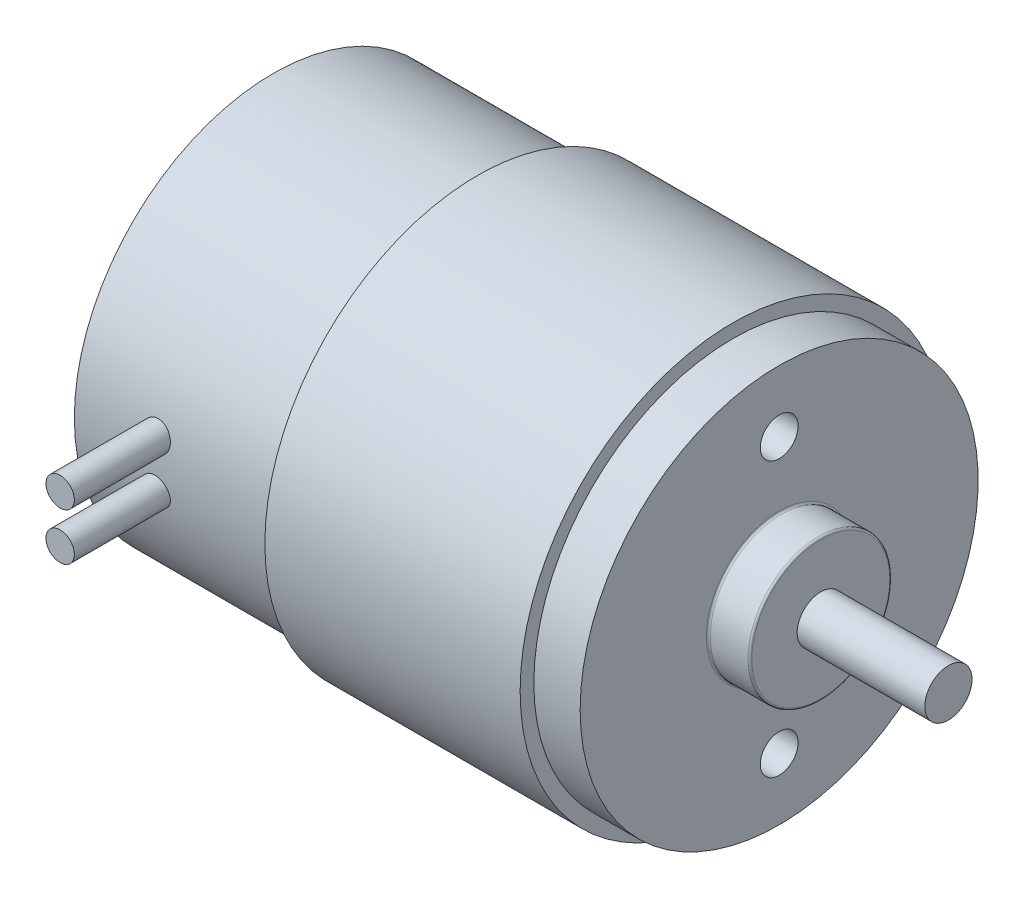
ISO-10303-21;
HEADER;
FILE_DESCRIPTION(('STEP AP214'),'2;1');
FILE_NAME('part.step','',(''),(''),'','','');
FILE_SCHEMA(('AUTOMOTIVE_DESIGN { 1 0 10303 214 1 1 1 1 }'));
ENDSEC;
DATA;
#1=APPLICATION_CONTEXT('core data for automotive mechanical design processes');
#2=APPLICATION_PROTOCOL_DEFINITION('international standard','automotive_design',2000,#1);
#3=PRODUCT_CONTEXT('',#1,'mechanical');
#4=PRODUCT('Part','Part','',(#3));
#5=PRODUCT_RELATED_PRODUCT_CATEGORY('part','',(#4));
#6=PRODUCT_DEFINITION_FORMATION('','',#4);
#7=PRODUCT_DEFINITION_CONTEXT('part definition',#1,'design');
#8=PRODUCT_DEFINITION('design','',#6,#7);
#9=PRODUCT_DEFINITION_SHAPE('','',#8);
#10=(LENGTH_UNIT() NAMED_UNIT(*) SI_UNIT(.MILLI.,.METRE.));
#11=(NAMED_UNIT(*) PLANE_ANGLE_UNIT() SI_UNIT($,.RADIAN.));
#12=(NAMED_UNIT(*) SI_UNIT($,.STERADIAN.) SOLID_ANGLE_UNIT());
#13=UNCERTAINTY_MEASURE_WITH_UNIT(LENGTH_MEASURE(1.E-05),#10,'distance_accuracy_value','');
#14=(GEOMETRIC_REPRESENTATION_CONTEXT(3) GLOBAL_UNCERTAINTY_ASSIGNED_CONTEXT((#13)) GLOBAL_UNIT_ASSIGNED_CONTEXT((#10,
#11,#12)) REPRESENTATION_CONTEXT('',''));
#15=CARTESIAN_POINT('',(0.,0.,0.));
#16=DIRECTION('',(0.,0.,1.));
#17=DIRECTION('',(1.,0.,0.));
#18=AXIS2_PLACEMENT_3D('',#15,#16,#17);
#19=CARTESIAN_POINT('',(-62.2,-7.5,0.));
#20=DIRECTION('',(-1.,0.,0.));
#21=DIRECTION('',(0.,0.,1.));
#22=AXIS2_PLACEMENT_3D('',#19,#20,#21);
#23=PLANE('',#22);
#24=CARTESIAN_POINT('',(-62.2,0.,0.));
#25=DIRECTION('',(-1.,0.,0.));
#26=DIRECTION('',(0.,0.,1.));
#27=AXIS2_PLACEMENT_3D('',#24,#25,#26);
#28=CIRCLE('',#27,7.3);
#29=CARTESIAN_POINT('',(-62.2,0.,7.3));
#30=VERTEX_POINT('',#29);
#31=EDGE_CURVE('P0_E22',#30,#30,#28,.T.);
#32=ORIENTED_EDGE('',*,*,#31,.T.);
#33=EDGE_LOOP('',(#32));
#34=FACE_BOUND('',#33,.T.);
#35=CARTESIAN_POINT('',(-62.2,0.,0.));
#36=DIRECTION('',(-1.,0.,0.));
#37=DIRECTION('',(0.,0.,1.));
#38=AXIS2_PLACEMENT_3D('',#35,#36,#37);
#39=CIRCLE('',#38,2.5);
#40=CARTESIAN_POINT('',(-62.2,0.,2.5));
#41=VERTEX_POINT('',#40);
#42=EDGE_CURVE('P0_E57',#41,#41,#39,.F.);
#43=ORIENTED_EDGE('',*,*,#42,.T.);
#44=EDGE_LOOP('',(#43));
#45=FACE_BOUND('',#44,.T.);
#46=ADVANCED_FACE('P0_F15',(#34,#45),#23,.T.);
#47=CARTESIAN_POINT('',(-57.,0.,0.));
#48=DIRECTION('',(-1.,0.,0.));
#49=DIRECTION('',(0.,0.,1.));
#50=AXIS2_PLACEMENT_3D('',#47,#48,#49);
#51=CYLINDRICAL_SURFACE('',#50,7.5);
#52=CARTESIAN_POINT('',(-57.4,0.,0.));
#53=DIRECTION('',(-1.,0.,0.));
#54=DIRECTION('',(0.,0.,1.));
#55=AXIS2_PLACEMENT_3D('',#52,#53,#54);
#56=CIRCLE('',#55,7.5);
#57=CARTESIAN_POINT('',(-57.4,0.,7.5));
#58=VERTEX_POINT('',#57);
#59=EDGE_CURVE('P0_E41',#58,#58,#56,.T.);
#60=ORIENTED_EDGE('',*,*,#59,.T.);
#61=EDGE_LOOP('',(#60));
#62=FACE_BOUND('',#61,.T.);
#63=CARTESIAN_POINT('',(-62.,0.,0.));
#64=DIRECTION('',(-1.,0.,0.));
#65=DIRECTION('',(0.,0.,1.));
#66=AXIS2_PLACEMENT_3D('',#63,#64,#65);
#67=CIRCLE('',#66,7.5);
#68=CARTESIAN_POINT('',(-62.,0.,7.5));
#69=VERTEX_POINT('',#68);
#70=EDGE_CURVE('P0_E44',#69,#69,#67,.F.);
#71=ORIENTED_EDGE('',*,*,#70,.T.);
#72=EDGE_LOOP('',(#71));
#73=FACE_BOUND('',#72,.T.);
#74=ADVANCED_FACE('P0_F135',(#62,#73),#51,.T.);
#75=CARTESIAN_POINT('',(-57.2,-7.5,0.));
#76=DIRECTION('',(-1.,0.,0.));
#77=DIRECTION('',(0.,0.,1.));
#78=AXIS2_PLACEMENT_3D('',#75,#76,#77);
#79=PLANE('',#78);
#80=CARTESIAN_POINT('',(-57.2,0.,0.));
#81=DIRECTION('',(-1.,0.,0.));
#82=DIRECTION('',(0.,0.,1.));
#83=AXIS2_PLACEMENT_3D('',#80,#81,#82);
#84=CIRCLE('',#83,7.7);
#85=CARTESIAN_POINT('',(-57.2,0.,7.7));
#86=VERTEX_POINT('',#85);
#87=EDGE_CURVE('P0_E38',#86,#86,#84,.F.);
#88=ORIENTED_EDGE('',*,*,#87,.T.);
#89=EDGE_LOOP('',(#88));
#90=FACE_BOUND('',#89,.T.);
#91=CARTESIAN_POINT('',(-57.2,0.,0.));
#92=DIRECTION('',(-1.,0.,0.));
#93=DIRECTION('',(0.,0.,1.));
#94=AXIS2_PLACEMENT_3D('',#91,#92,#93);
#95=CIRCLE('',#94,20.35);
#96=CARTESIAN_POINT('',(-57.2,0.,20.35));
#97=VERTEX_POINT('',#96);
#98=EDGE_CURVE('P0_E53',#97,#97,#95,.T.);
#99=ORIENTED_EDGE('',*,*,#98,.T.);
#100=EDGE_LOOP('',(#99));
#101=FACE_BOUND('',#100,.T.);
#102=ADVANCED_FACE('P0_F141',(#90,#101),#79,.T.);
#103=CARTESIAN_POINT('',(-57.,0.,0.));
#104=DIRECTION('',(-1.,0.,0.));
#105=DIRECTION('',(0.,0.,1.));
#106=AXIS2_PLACEMENT_3D('',#103,#104,#105);
#107=CYLINDRICAL_SURFACE('',#106,20.35);
#108=CARTESIAN_POINT('',(-57.9,0.,0.));
#109=DIRECTION('',(-1.,0.,0.));
#110=DIRECTION('',(0.,0.,1.));
#111=AXIS2_PLACEMENT_3D('',#108,#109,#110);
#112=CIRCLE('',#111,20.35);
#113=CARTESIAN_POINT('',(-57.9,0.,20.35));
#114=VERTEX_POINT('',#113);
#115=EDGE_CURVE('P0_E61',#114,#114,#112,.T.);
#116=ORIENTED_EDGE('',*,*,#115,.T.);
#117=EDGE_LOOP('',(#116));
#118=FACE_BOUND('',#117,.T.);
#119=ORIENTED_EDGE('',*,*,#98,.F.);
#120=EDGE_LOOP('',(#119));
#121=FACE_BOUND('',#120,.T.);
#122=ADVANCED_FACE('P0_F295',(#118,#121),#107,.F.);
#123=CARTESIAN_POINT('',(-57.9,-21.05,0.));
#124=DIRECTION('',(-1.,0.,0.));
#125=DIRECTION('',(0.,0.,1.));
#126=AXIS2_PLACEMENT_3D('',#123,#124,#125);
#127=PLANE('',#126);
#128=CARTESIAN_POINT('',(-57.9,0.,0.));
#129=DIRECTION('',(-1.,0.,0.));
#130=DIRECTION('',(0.,0.,1.));
#131=AXIS2_PLACEMENT_3D('',#128,#129,#130);
#132=CIRCLE('',#131,21.05);
#133=CARTESIAN_POINT('',(-57.9,0.,21.05));
#134=VERTEX_POINT('',#133);
#135=EDGE_CURVE('P0_E64',#134,#134,#132,.T.);
#136=ORIENTED_EDGE('',*,*,#135,.T.);
#137=EDGE_LOOP('',(#136));
#138=FACE_BOUND('',#137,.T.);
#139=ORIENTED_EDGE('',*,*,#115,.F.);
#140=EDGE_LOOP('',(#139));
#141=FACE_BOUND('',#140,.T.);
#142=ADVANCED_FACE('P0_F132',(#138,#141),#127,.T.);
#143=CARTESIAN_POINT('',(-57.,0.,0.));
#144=DIRECTION('',(-1.,0.,0.));
#145=DIRECTION('',(0.,0.,1.));
#146=AXIS2_PLACEMENT_3D('',#143,#144,#145);
#147=CYLINDRICAL_SURFACE('',#146,21.05);
#148=CARTESIAN_POINT('',(-36.3,0.,0.));
#149=DIRECTION('',(-1.,0.,0.));
#150=DIRECTION('',(0.,0.,1.));
#151=AXIS2_PLACEMENT_3D('',#148,#149,#150);
#152=CIRCLE('',#151,21.05);
#153=CARTESIAN_POINT('',(-36.3,0.,21.05));
#154=VERTEX_POINT('',#153);
#155=EDGE_CURVE('P0_E50',#154,#154,#152,.F.);
#156=ORIENTED_EDGE('',*,*,#155,.F.);
#157=EDGE_LOOP('',(#156));
#158=FACE_BOUND('',#157,.T.);
#159=ORIENTED_EDGE('',*,*,#135,.F.);
#160=EDGE_LOOP('',(#159));
#161=FACE_BOUND('',#160,.T.);
#162=ADVANCED_FACE('P0_F120',(#158,#161),#147,.T.);
#163=CARTESIAN_POINT('',(0.,0.,0.));
#164=DIRECTION('',(-1.,0.,0.));
#165=DIRECTION('',(0.,0.,1.));
#166=AXIS2_PLACEMENT_3D('',#163,#164,#165);
#167=CYLINDRICAL_SURFACE('',#166,2.5);
#168=ORIENTED_EDGE('',*,*,#42,.F.);
#169=EDGE_LOOP('',(#168));
#170=FACE_BOUND('',#169,.T.);
#171=CARTESIAN_POINT('',(-62.5,0.,0.));
#172=DIRECTION('',(-1.,0.,0.));
#173=DIRECTION('',(0.,0.,1.));
#174=AXIS2_PLACEMENT_3D('',#171,#172,#173);
#175=CIRCLE('',#174,2.5);
#176=CARTESIAN_POINT('',(-62.5,0.,2.5));
#177=VERTEX_POINT('',#176);
#178=EDGE_CURVE('P0_E74',#177,#177,#175,.T.);
#179=ORIENTED_EDGE('',*,*,#178,.F.);
#180=EDGE_LOOP('',(#179));
#181=FACE_BOUND('',#180,.T.);
#182=ADVANCED_FACE('P0_F131',(#170,#181),#167,.T.);
#183=CARTESIAN_POINT('',(-62.5,2.5,0.));
#184=DIRECTION('',(1.,0.,0.));
#185=DIRECTION('',(0.,0.,-1.));
#186=AXIS2_PLACEMENT_3D('',#183,#184,#185);
#187=PLANE('',#186);
#188=ORIENTED_EDGE('',*,*,#178,.T.);
#189=EDGE_LOOP('',(#188));
#190=FACE_BOUND('',#189,.T.);
#191=ADVANCED_FACE('P0_F190',(#190),#187,.F.);
#192=CARTESIAN_POINT('',(-9.3,0.,0.));
#193=DIRECTION('',(1.,0.,0.));
#194=DIRECTION('',(0.,0.,-1.));
#195=AXIS2_PLACEMENT_3D('',#192,#193,#194);
#196=PLANE('',#195);
#197=CARTESIAN_POINT('',(-9.3,0.,0.));
#198=DIRECTION('',(1.,0.,0.));
#199=DIRECTION('',(0.,0.,-1.));
#200=AXIS2_PLACEMENT_3D('',#197,#198,#199);
#201=CIRCLE('',#200,21.05);
#202=CARTESIAN_POINT('',(-9.3,0.,-21.05));
#203=VERTEX_POINT('',#202);
#204=EDGE_CURVE('P0_E47',#203,#203,#201,.F.);
#205=ORIENTED_EDGE('',*,*,#204,.T.);
#206=EDGE_LOOP('',(#205));
#207=FACE_BOUND('',#206,.T.);
#208=CARTESIAN_POINT('',(-9.3,0.,0.));
#209=DIRECTION('',(-1.,0.,0.));
#210=DIRECTION('',(0.,0.,1.));
#211=AXIS2_PLACEMENT_3D('',#208,#209,#210);
#212=CIRCLE('',#211,22.5);
#213=CARTESIAN_POINT('',(-9.3,0.,22.5));
#214=VERTEX_POINT('',#213);
#215=EDGE_CURVE('P0_E77',#214,#214,#212,.T.);
#216=ORIENTED_EDGE('',*,*,#215,.F.);
#217=EDGE_LOOP('',(#216));
#218=FACE_BOUND('',#217,.T.);
#219=ADVANCED_FACE('P0_F193',(#207,#218),#196,.T.);
#220=CARTESIAN_POINT('',(0.,0.,0.));
#221=DIRECTION('',(-1.,0.,0.));
#222=DIRECTION('',(0.,0.,1.));
#223=AXIS2_PLACEMENT_3D('',#220,#221,#222);
#224=CYLINDRICAL_SURFACE('',#223,22.5);
#225=ORIENTED_EDGE('',*,*,#215,.T.);
#226=EDGE_LOOP('',(#225));
#227=FACE_BOUND('',#226,.T.);
#228=CARTESIAN_POINT('',(-36.3,0.,0.));
#229=DIRECTION('',(-1.,0.,0.));
#230=DIRECTION('',(0.,0.,1.));
#231=AXIS2_PLACEMENT_3D('',#228,#229,#230);
#232=CIRCLE('',#231,22.5);
#233=CARTESIAN_POINT('',(-36.3,0.,22.5));
#234=VERTEX_POINT('',#233);
#235=EDGE_CURVE('P0_E80',#234,#234,#232,.T.);
#236=ORIENTED_EDGE('',*,*,#235,.F.);
#237=EDGE_LOOP('',(#236));
#238=FACE_BOUND('',#237,.T.);
#239=ADVANCED_FACE('P0_F197',(#227,#238),#224,.T.);
#240=CARTESIAN_POINT('',(-36.3,0.,0.));
#241=DIRECTION('',(-1.,0.,0.));
#242=DIRECTION('',(0.,0.,1.));
#243=AXIS2_PLACEMENT_3D('',#240,#241,#242);
#244=PLANE('',#243);
#245=ORIENTED_EDGE('',*,*,#235,.T.);
#246=EDGE_LOOP('',(#245));
#247=FACE_BOUND('',#246,.T.);
#248=ORIENTED_EDGE('',*,*,#155,.T.);
#249=EDGE_LOOP('',(#248));
#250=FACE_BOUND('',#249,.T.);
#251=ADVANCED_FACE('P0_F185',(#247,#250),#244,.T.);
#252=CARTESIAN_POINT('',(13.5,0.,0.));
#253=DIRECTION('',(-1.,0.,0.));
#254=DIRECTION('',(0.,0.,1.));
#255=AXIS2_PLACEMENT_3D('',#252,#253,#254);
#256=PLANE('',#255);
#257=CARTESIAN_POINT('',(13.5,0.,0.));
#258=DIRECTION('',(-1.,0.,0.));
#259=DIRECTION('',(0.,0.,1.));
#260=AXIS2_PLACEMENT_3D('',#257,#258,#259);
#261=CIRCLE('',#260,2.5);
#262=CARTESIAN_POINT('',(13.5,0.,2.5));
#263=VERTEX_POINT('',#262);
#264=EDGE_CURVE('P0_E58',#263,#263,#261,.T.);
#265=ORIENTED_EDGE('',*,*,#264,.F.);
#266=EDGE_LOOP('',(#265));
#267=FACE_BOUND('',#266,.T.);
#268=ADVANCED_FACE('P0_F182',(#267),#256,.F.);
#269=CARTESIAN_POINT('',(0.,0.,0.));
#270=DIRECTION('',(1.,0.,0.));
#271=DIRECTION('',(0.,0.,-1.));
#272=AXIS2_PLACEMENT_3D('',#269,#270,#271);
#273=CIRCLE('',#272,2.5);
#274=CARTESIAN_POINT('',(0.,0.,-2.5));
#275=VERTEX_POINT('',#274);
#276=EDGE_CURVE('P0_E54',#275,#275,#273,.F.);
#277=ORIENTED_EDGE('',*,*,#276,.F.);
#278=EDGE_LOOP('',(#277));
#279=FACE_BOUND('',#278,.T.);
#280=ORIENTED_EDGE('',*,*,#264,.T.);
#281=EDGE_LOOP('',(#280));
#282=FACE_BOUND('',#281,.T.);
#283=ADVANCED_FACE('P0_F179',(#279,#282),#167,.T.);
#284=CARTESIAN_POINT('',(0.,0.,0.));
#285=DIRECTION('',(1.,0.,0.));
#286=DIRECTION('',(0.,0.,-1.));
#287=AXIS2_PLACEMENT_3D('',#284,#285,#286);
#288=PLANE('',#287);
#289=CARTESIAN_POINT('',(0.,0.,0.));
#290=DIRECTION('',(1.,0.,0.));
#291=DIRECTION('',(0.,0.,-1.));
#292=AXIS2_PLACEMENT_3D('',#289,#290,#291);
#293=CIRCLE('',#292,7.3);
#294=CARTESIAN_POINT('',(0.,0.,-7.3));
#295=VERTEX_POINT('',#294);
#296=EDGE_CURVE('P0_E10',#295,#295,#293,.T.);
#297=ORIENTED_EDGE('',*,*,#296,.T.);
#298=EDGE_LOOP('',(#297));
#299=FACE_BOUND('',#298,.T.);
#300=ORIENTED_EDGE('',*,*,#276,.T.);
#301=EDGE_LOOP('',(#300));
#302=FACE_BOUND('',#301,.T.);
#303=ADVANCED_FACE('P0_F172',(#299,#302),#288,.T.);
#304=CARTESIAN_POINT('',(-57.,0.,0.));
#305=DIRECTION('',(-1.,0.,0.));
#306=DIRECTION('',(0.,0.,1.));
#307=AXIS2_PLACEMENT_3D('',#304,#305,#306);
#308=CYLINDRICAL_SURFACE('',#307,7.5);
#309=CARTESIAN_POINT('',(-4.2,0.,0.));
#310=DIRECTION('',(1.,0.,0.));
#311=DIRECTION('',(0.,0.,-1.));
#312=AXIS2_PLACEMENT_3D('',#309,#310,#311);
#313=CIRCLE('',#312,7.5);
#314=CARTESIAN_POINT('',(-4.2,0.,-7.5));
#315=VERTEX_POINT('',#314);
#316=EDGE_CURVE('P0_E26',#315,#315,#313,.T.);
#317=ORIENTED_EDGE('',*,*,#316,.T.);
#318=EDGE_LOOP('',(#317));
#319=FACE_BOUND('',#318,.T.);
#320=CARTESIAN_POINT('',(-0.2,0.,0.));
#321=DIRECTION('',(1.,0.,0.));
#322=DIRECTION('',(0.,0.,-1.));
#323=AXIS2_PLACEMENT_3D('',#320,#321,#322);
#324=CIRCLE('',#323,7.5);
#325=CARTESIAN_POINT('',(-0.2,0.,-7.5));
#326=VERTEX_POINT('',#325);
#327=EDGE_CURVE('P0_E30',#326,#326,#324,.F.);
#328=ORIENTED_EDGE('',*,*,#327,.T.);
#329=EDGE_LOOP('',(#328));
#330=FACE_BOUND('',#329,.T.);
#331=ADVANCED_FACE('P0_F109',(#319,#330),#308,.T.);
#332=CARTESIAN_POINT('',(-4.4,-7.5,0.));
#333=DIRECTION('',(1.,0.,0.));
#334=DIRECTION('',(0.,0.,-1.));
#335=AXIS2_PLACEMENT_3D('',#332,#333,#334);
#336=PLANE('',#335);
#337=CARTESIAN_POINT('',(-4.4,0.,0.));
#338=DIRECTION('',(1.,0.,0.));
#339=DIRECTION('',(0.,0.,-1.));
#340=AXIS2_PLACEMENT_3D('',#337,#338,#339);
#341=CIRCLE('',#340,7.7);
#342=CARTESIAN_POINT('',(-4.4,0.,-7.7));
#343=VERTEX_POINT('',#342);
#344=EDGE_CURVE('P0_E35',#343,#343,#341,.F.);
#345=ORIENTED_EDGE('',*,*,#344,.T.);
#346=EDGE_LOOP('',(#345));
#347=FACE_BOUND('',#346,.T.);
#348=CARTESIAN_POINT('',(-4.4,-14.5,0.));
#349=DIRECTION('',(1.,0.,0.));
#350=DIRECTION('',(0.,0.,-1.));
#351=AXIS2_PLACEMENT_3D('',#348,#349,#350);
#352=CIRCLE('',#351,2.);
#353=CARTESIAN_POINT('',(-4.4,-14.5,-2.));
#354=VERTEX_POINT('',#353);
#355=EDGE_CURVE('P0_E90',#354,#354,#352,.T.);
#356=ORIENTED_EDGE('',*,*,#355,.F.);
#357=EDGE_LOOP('',(#356));
#358=FACE_BOUND('',#357,.T.);
#359=CARTESIAN_POINT('',(-4.4,14.5,0.));
#360=DIRECTION('',(1.,0.,0.));
#361=DIRECTION('',(0.,0.,-1.));
#362=AXIS2_PLACEMENT_3D('',#359,#360,#361);
#363=CIRCLE('',#362,2.);
#364=CARTESIAN_POINT('',(-4.4,14.5,-1.99999999999999));
#365=VERTEX_POINT('',#364);
#366=EDGE_CURVE('P0_E84',#365,#365,#363,.T.);
#367=ORIENTED_EDGE('',*,*,#366,.F.);
#368=EDGE_LOOP('',(#367));
#369=FACE_BOUND('',#368,.T.);
#370=CARTESIAN_POINT('',(-4.4,0.,0.));
#371=DIRECTION('',(-1.,0.,0.));
#372=DIRECTION('',(0.,0.,1.));
#373=AXIS2_PLACEMENT_3D('',#370,#371,#372);
#374=CIRCLE('',#373,21.05);
#375=CARTESIAN_POINT('',(-4.4,0.,21.05));
#376=VERTEX_POINT('',#375);
#377=EDGE_CURVE('P0_E67',#376,#376,#374,.T.);
#378=ORIENTED_EDGE('',*,*,#377,.F.);
#379=EDGE_LOOP('',(#378));
#380=FACE_BOUND('',#379,.T.);
#381=ADVANCED_FACE('P0_F105',(#347,#358,#369,#380),#336,.T.);
#382=ORIENTED_EDGE('',*,*,#204,.F.);
#383=EDGE_LOOP('',(#382));
#384=FACE_BOUND('',#383,.T.);
#385=ORIENTED_EDGE('',*,*,#377,.T.);
#386=EDGE_LOOP('',(#385));
#387=FACE_BOUND('',#386,.T.);
#388=ADVANCED_FACE('P0_F108',(#384,#387),#147,.T.);
#389=CARTESIAN_POINT('',(-9.4,14.5,0.));
#390=DIRECTION('',(1.,0.,0.));
#391=DIRECTION('',(0.,0.,-1.));
#392=AXIS2_PLACEMENT_3D('',#389,#390,#391);
#393=CYLINDRICAL_SURFACE('',#392,2.);
#394=CARTESIAN_POINT('',(-9.4,14.5,0.));
#395=DIRECTION('',(1.,0.,0.));
#396=DIRECTION('',(0.,0.,-1.));
#397=AXIS2_PLACEMENT_3D('',#394,#395,#396);
#398=CIRCLE('',#397,2.);
#399=CARTESIAN_POINT('',(-9.4,14.5,-1.99999999999999));
#400=VERTEX_POINT('',#399);
#401=EDGE_CURVE('P0_E83',#400,#400,#398,.T.);
#402=ORIENTED_EDGE('',*,*,#401,.F.);
#403=EDGE_LOOP('',(#402));
#404=FACE_BOUND('',#403,.T.);
#405=ORIENTED_EDGE('',*,*,#366,.T.);
#406=EDGE_LOOP('',(#405));
#407=FACE_BOUND('',#406,.T.);
#408=ADVANCED_FACE('P0_F117',(#404,#407),#393,.F.);
#409=CARTESIAN_POINT('',(-9.4,14.5,0.));
#410=DIRECTION('',(1.,0.,0.));
#411=DIRECTION('',(0.,0.,-1.));
#412=AXIS2_PLACEMENT_3D('',#409,#410,#411);
#413=PLANE('',#412);
#414=ORIENTED_EDGE('',*,*,#401,.T.);
#415=EDGE_LOOP('',(#414));
#416=FACE_BOUND('',#415,.T.);
#417=ADVANCED_FACE('P0_F101',(#416),#413,.T.);
#418=CARTESIAN_POINT('',(-9.4,-14.5,0.));
#419=DIRECTION('',(1.,0.,0.));
#420=DIRECTION('',(0.,0.,-1.));
#421=AXIS2_PLACEMENT_3D('',#418,#419,#420);
#422=CYLINDRICAL_SURFACE('',#421,2.);
#423=CARTESIAN_POINT('',(-9.4,-14.5,0.));
#424=DIRECTION('',(1.,0.,0.));
#425=DIRECTION('',(0.,0.,-1.));
#426=AXIS2_PLACEMENT_3D('',#423,#424,#425);
#427=CIRCLE('',#426,2.);
#428=CARTESIAN_POINT('',(-9.4,-14.5,-2.));
#429=VERTEX_POINT('',#428);
#430=EDGE_CURVE('P0_E87',#429,#429,#427,.T.);
#431=ORIENTED_EDGE('',*,*,#430,.F.);
#432=EDGE_LOOP('',(#431));
#433=FACE_BOUND('',#432,.T.);
#434=ORIENTED_EDGE('',*,*,#355,.T.);
#435=EDGE_LOOP('',(#434));
#436=FACE_BOUND('',#435,.T.);
#437=ADVANCED_FACE('P0_F98',(#433,#436),#422,.F.);
#438=CARTESIAN_POINT('',(-9.4,-14.5,0.));
#439=DIRECTION('',(1.,0.,0.));
#440=DIRECTION('',(0.,0.,-1.));
#441=AXIS2_PLACEMENT_3D('',#438,#439,#440);
#442=PLANE('',#441);
#443=ORIENTED_EDGE('',*,*,#430,.T.);
#444=EDGE_LOOP('',(#443));
#445=FACE_BOUND('',#444,.T.);
#446=ADVANCED_FACE('P0_F96',(#445),#442,.T.);
#447=CARTESIAN_POINT('',(-57.4,0.,0.));
#448=DIRECTION('',(-1.,0.,0.));
#449=DIRECTION('',(0.,0.,1.));
#450=AXIS2_PLACEMENT_3D('',#447,#448,#449);
#451=TOROIDAL_SURFACE('',#450,7.7,0.2);
#452=ORIENTED_EDGE('',*,*,#87,.F.);
#453=EDGE_LOOP('',(#452));
#454=FACE_BOUND('',#453,.T.);
#455=ORIENTED_EDGE('',*,*,#59,.F.);
#456=EDGE_LOOP('',(#455));
#457=FACE_BOUND('',#456,.T.);
#458=ADVANCED_FACE('P0_F147',(#454,#457),#451,.F.);
#459=CARTESIAN_POINT('',(-4.2,0.,0.));
#460=DIRECTION('',(1.,0.,0.));
#461=DIRECTION('',(0.,0.,-1.));
#462=AXIS2_PLACEMENT_3D('',#459,#460,#461);
#463=TOROIDAL_SURFACE('',#462,7.7,0.2);
#464=ORIENTED_EDGE('',*,*,#316,.F.);
#465=EDGE_LOOP('',(#464));
#466=FACE_BOUND('',#465,.T.);
#467=ORIENTED_EDGE('',*,*,#344,.F.);
#468=EDGE_LOOP('',(#467));
#469=FACE_BOUND('',#468,.T.);
#470=ADVANCED_FACE('P0_F150',(#466,#469),#463,.F.);
#471=CARTESIAN_POINT('',(-62.,0.,0.));
#472=DIRECTION('',(-1.,0.,0.));
#473=DIRECTION('',(0.,0.,1.));
#474=AXIS2_PLACEMENT_3D('',#471,#472,#473);
#475=TOROIDAL_SURFACE('',#474,7.3,0.2);
#476=ORIENTED_EDGE('',*,*,#70,.F.);
#477=EDGE_LOOP('',(#476));
#478=FACE_BOUND('',#477,.T.);
#479=ORIENTED_EDGE('',*,*,#31,.F.);
#480=EDGE_LOOP('',(#479));
#481=FACE_BOUND('',#480,.T.);
#482=ADVANCED_FACE('P0_F153',(#478,#481),#475,.T.);
#483=CARTESIAN_POINT('',(-0.2,0.,0.));
#484=DIRECTION('',(1.,0.,0.));
#485=DIRECTION('',(0.,0.,-1.));
#486=AXIS2_PLACEMENT_3D('',#483,#484,#485);
#487=TOROIDAL_SURFACE('',#486,7.3,0.2);
#488=ORIENTED_EDGE('',*,*,#296,.F.);
#489=EDGE_LOOP('',(#488));
#490=FACE_BOUND('',#489,.T.);
#491=ORIENTED_EDGE('',*,*,#327,.F.);
#492=EDGE_LOOP('',(#491));
#493=FACE_BOUND('',#492,.T.);
#494=ADVANCED_FACE('P0_F17',(#490,#493),#487,.T.);
#495=CLOSED_SHELL('',(#46,#74,#102,#122,#142,#162,#182,#191,#219,#239,#251,#268,#283,#303,#331,
#381,#388,#408,#417,#437,#446,#458,#470,#482,#494));
#496=MANIFOLD_SOLID_BREP('P0_B1',#495);
#497=CARTESIAN_POINT('',(-57.,0.,0.));
#498=DIRECTION('',(-1.,0.,0.));
#499=DIRECTION('',(0.,0.,1.));
#500=AXIS2_PLACEMENT_3D('',#497,#498,#499);
#501=CYLINDRICAL_SURFACE('',#500,21.05);
#502=CARTESIAN_POINT('',(-47.9,2.5,20.9010167216812));
#503=CARTESIAN_POINT('',(-47.9000035407732,2.4158662777642,20.9110793764247));
#504=CARTESIAN_POINT('',(-47.9071010654834,2.33161582240635,20.9206367097097));
#505=CARTESIAN_POINT('',(-47.9353803203038,2.16530996044392,20.938503971184));
#506=CARTESIAN_POINT('',(-47.9565768704664,2.08325695818029,20.9468125755058));
#507=CARTESIAN_POINT('',(-48.0125190960799,1.92377660003183,20.9620609725056));
#508=CARTESIAN_POINT('',(-48.0472626559561,1.84634852406949,20.9690009786567));
#509=CARTESIAN_POINT('',(-48.1293432732354,1.69838395781591,20.9815040436769));
#510=CARTESIAN_POINT('',(-48.1766774420326,1.62784589184978,20.9870674178161));
#511=CARTESIAN_POINT('',(-48.2823723579542,1.49600051472983,20.9968769376196));
#512=CARTESIAN_POINT('',(-48.3406826641129,1.43465319653322,21.0011288829768));
#513=CARTESIAN_POINT('',(-48.4668197616067,1.32259103957095,21.0084843529481));
#514=CARTESIAN_POINT('',(-48.5346467562169,1.27187642797613,21.0115878530263));
#515=CARTESIAN_POINT('',(-48.6777112304001,1.18265841265314,21.0167984910876));
#516=CARTESIAN_POINT('',(-48.7529304678064,1.14412589155686,21.0189080108764));
#517=CARTESIAN_POINT('',(-48.9087803373575,1.08021243797253,21.0222898669676));
#518=CARTESIAN_POINT('',(-48.9894109509849,1.05483146048269,21.0235622061345));
#519=CARTESIAN_POINT('',(-49.1537836897267,1.01795028320224,21.0253804184087));
#520=CARTESIAN_POINT('',(-49.2375254234693,1.00644834351304,21.0259263825763));
#521=CARTESIAN_POINT('',(-49.4057535427615,0.997648033608831,21.0263458238347));
#522=CARTESIAN_POINT('',(-49.4902399281144,1.00034965964146,21.0262193011032));
#523=CARTESIAN_POINT('',(-49.6575758894251,1.01988119538901,21.0252808777447));
#524=CARTESIAN_POINT('',(-49.740425153927,1.03671376747286,21.0244688479634));
#525=CARTESIAN_POINT('',(-49.9021180740056,1.0840292260991,21.0220821302687));
#526=CARTESIAN_POINT('',(-49.9809617314431,1.11451210629986,21.0205074427098));
#527=CARTESIAN_POINT('',(-50.1323968728713,1.18825057070615,21.0164677583525));
#528=CARTESIAN_POINT('',(-50.2049889630393,1.23150491473356,21.0140028479944));
#529=CARTESIAN_POINT('',(-50.3418690287977,1.32954302416387,21.0080274868469));
#530=CARTESIAN_POINT('',(-50.4061570598425,1.38432671256762,21.0045170430401));
#531=CARTESIAN_POINT('',(-50.52460200002,1.5038338453837,20.9962987656353));
#532=CARTESIAN_POINT('',(-50.5787604728864,1.5685557527862,20.9915911171191));
#533=CARTESIAN_POINT('',(-50.6754409399708,1.70607604734139,20.9808615938868));
#534=CARTESIAN_POINT('',(-50.7179629598619,1.77887441667481,20.9748397220704));
#535=CARTESIAN_POINT('',(-50.7902460905212,1.93054286616158,20.9614241007118));
#536=CARTESIAN_POINT('',(-50.8199917273676,2.00942017319378,20.9540287030778));
#537=CARTESIAN_POINT('',(-50.8658602694972,2.17091022737851,20.9379136933156));
#538=CARTESIAN_POINT('',(-50.8819828799965,2.25352305532191,20.9291940525375));
#539=CARTESIAN_POINT('',(-50.9002600666949,2.42055184385131,20.9105361566796));
#540=CARTESIAN_POINT('',(-50.902346769301,2.50497458856871,20.900592216553));
#541=CARTESIAN_POINT('',(-50.8923773686962,2.67286617563522,20.8797855345015));
#542=CARTESIAN_POINT('',(-50.880320549094,2.75633496944899,20.8689227460612));
#543=CARTESIAN_POINT('',(-50.8422911404279,2.92067416531069,20.846560803466));
#544=CARTESIAN_POINT('',(-50.8162070785786,3.00151817459569,20.8350572226983));
#545=CARTESIAN_POINT('',(-50.7507999411068,3.15765055906063,20.8119671669516));
#546=CARTESIAN_POINT('',(-50.7114762321633,3.23293866826291,20.800380688033));
#547=CARTESIAN_POINT('',(-50.6204242427042,3.37624751921057,20.7776021654217));
#548=CARTESIAN_POINT('',(-50.5686307256397,3.44422722720006,20.766412563489));
#549=CARTESIAN_POINT('',(-50.4541680095632,3.57050992260244,20.7450733497216));
#550=CARTESIAN_POINT('',(-50.3914989534397,3.62881303713179,20.7349237242259));
#551=CARTESIAN_POINT('',(-50.2573492212434,3.73376195841836,20.7162824032069));
#552=CARTESIAN_POINT('',(-50.1859138622516,3.78046423290897,20.707782722545));
#553=CARTESIAN_POINT('',(-50.0359922904262,3.86116081492125,20.6928883666651));
#554=CARTESIAN_POINT('',(-49.9575067427694,3.89515631975292,20.6864934931259));
#555=CARTESIAN_POINT('',(-49.796971289956,3.94895572323473,20.6762905799054));
#556=CARTESIAN_POINT('',(-49.7149926433504,3.96896514494796,20.6724451223857));
#557=CARTESIAN_POINT('',(-49.548764242899,3.99497303773138,20.6674350012837));
#558=CARTESIAN_POINT('',(-49.4645146972188,4.00097278863189,20.6662700928244));
#559=CARTESIAN_POINT('',(-49.2973547990829,3.99878509130605,20.6666934339365));
#560=CARTESIAN_POINT('',(-49.2144417763535,3.99078888743618,20.668244570871));
#561=CARTESIAN_POINT('',(-49.0511644877781,3.96123132507384,20.6739297134202));
#562=CARTESIAN_POINT('',(-48.970800197837,3.93967009486252,20.6780636946096));
#563=CARTESIAN_POINT('',(-48.8148683181757,3.8836491645589,20.6886581451127));
#564=CARTESIAN_POINT('',(-48.7393008165064,3.84918922777519,20.6951186571182));
#565=CARTESIAN_POINT('',(-48.5950174101539,3.76840068268972,20.7099815597162));
#566=CARTESIAN_POINT('',(-48.5263017139681,3.72207171337169,20.7183840093752));
#567=CARTESIAN_POINT('',(-48.3966773828927,3.61818334397792,20.7367803971959));
#568=CARTESIAN_POINT('',(-48.3358845876986,3.56048292930138,20.7467939946375));
#569=CARTESIAN_POINT('',(-48.2247874675304,3.43586632785138,20.7677949719796));
#570=CARTESIAN_POINT('',(-48.1744864863535,3.36894721427783,20.7787826607432));
#571=CARTESIAN_POINT('',(-48.0850254452357,3.2266473820785,20.8013584287784));
#572=CARTESIAN_POINT('',(-48.0460505275303,3.15115139831153,20.8129531819326));
#573=CARTESIAN_POINT('',(-47.9814075641163,2.99471569247621,20.8360362146372));
#574=CARTESIAN_POINT('',(-47.9557250803893,2.91378198522586,20.8475245963442));
#575=CARTESIAN_POINT('',(-47.9247476485914,2.7770084328837,20.8660906764388));
#576=CARTESIAN_POINT('',(-47.9154836568851,2.72205746562055,20.8733325718879));
#577=CARTESIAN_POINT('',(-47.9031086489311,2.61142141086766,20.8874624765086));
#578=CARTESIAN_POINT('',(-47.8999976543333,2.55573632079555,20.894350484435));
#579=CARTESIAN_POINT('',(-47.9,2.5,20.9010167216812));
#580=B_SPLINE_CURVE_WITH_KNOTS('',3,(#502,#503,#504,#505,#506,#507,#508,#509,#510,#511,#512,
#513,#514,#515,#516,#517,#518,#519,#520,#521,#522,#523,#524,#525,#526,#527,#528,#529,#530,#531,
#532,#533,#534,#535,#536,#537,#538,#539,#540,#541,#542,#543,#544,#545,#546,#547,#548,#549,#550,
#551,#552,#553,#554,#555,#556,#557,#558,#559,#560,#561,#562,#563,#564,#565,#566,#567,#568,#569,
#570,#571,#572,#573,#574,#575,#576,#577,#578,#579),.UNSPECIFIED.,.T.,.F.,(4,2,2,2,2,2,2,2,2,2,2,
2,2,2,2,2,2,2,2,2,2,2,2,2,2,2,2,2,2,2,2,2,2,2,2,2,2,2,4),(0.,0.253997641300132,
0.508262692541744,0.76248805226193,1.01665513644908,1.26968151275904,1.52271329449988,
1.77513563094803,2.02755710365511,2.27994692911049,2.53233668788851,2.7847740093346,
3.03721121350408,3.28962391271506,3.54203492623187,3.79440694199805,4.04677840096166,
4.29945465976485,4.55213638600078,4.80603913504522,5.05995474521464,5.31591867204746,
5.5718948447055,5.82924043934815,6.08658265310601,6.3426465485018,6.59868630989603,
6.8508796826361,7.10305001576614,7.35180147420514,7.60055058029764,7.84930425116276,
8.0980654891808,8.35013139547926,8.60227751419213,8.8583393051786,9.11412237935438,
9.28238837102194,9.4506549547485),.UNSPECIFIED.);
#581=CARTESIAN_POINT('',(-47.9,2.5,20.9010167216812));
#582=VERTEX_POINT('',#581);
#583=EDGE_CURVE('P1_E10',#582,#582,#580,.T.);
#584=ORIENTED_EDGE('',*,*,#583,.T.);
#585=EDGE_LOOP('',(#584));
#586=FACE_BOUND('',#585,.T.);
#587=ADVANCED_FACE('P1_F15',(#586),#501,.F.);
#588=CARTESIAN_POINT('',(-49.4,2.5,-500000.));
#589=DIRECTION('',(0.,0.,1.));
#590=DIRECTION('',(1.,0.,0.));
#591=AXIS2_PLACEMENT_3D('',#588,#589,#590);
#592=CYLINDRICAL_SURFACE('',#591,1.5);
#593=ORIENTED_EDGE('',*,*,#583,.F.);
#594=EDGE_LOOP('',(#593));
#595=FACE_BOUND('',#594,.T.);
#596=CARTESIAN_POINT('',(-49.4,2.5,31.05));
#597=DIRECTION('',(0.,0.,1.));
#598=DIRECTION('',(1.,0.,0.));
#599=AXIS2_PLACEMENT_3D('',#596,#597,#598);
#600=CIRCLE('',#599,1.5);
#601=CARTESIAN_POINT('',(-47.9,2.5,31.05));
#602=VERTEX_POINT('',#601);
#603=EDGE_CURVE('P1_E25',#602,#602,#600,.T.);
#604=ORIENTED_EDGE('',*,*,#603,.F.);
#605=EDGE_LOOP('',(#604));
#606=FACE_BOUND('',#605,.T.);
#607=ADVANCED_FACE('P1_F33',(#595,#606),#592,.T.);
#608=CARTESIAN_POINT('',(-49.4,2.5,31.05));
#609=DIRECTION('',(0.,0.,1.));
#610=DIRECTION('',(1.,0.,0.));
#611=AXIS2_PLACEMENT_3D('',#608,#609,#610);
#612=PLANE('',#611);
#613=ORIENTED_EDGE('',*,*,#603,.T.);
#614=EDGE_LOOP('',(#613));
#615=FACE_BOUND('',#614,.T.);
#616=ADVANCED_FACE('P1_F31',(#615),#612,.T.);
#617=CLOSED_SHELL('',(#587,#607,#616));
#618=MANIFOLD_SOLID_BREP('P1_B1',#617);
#619=CARTESIAN_POINT('',(-57.,0.,0.));
#620=DIRECTION('',(-1.,0.,0.));
#621=DIRECTION('',(0.,0.,1.));
#622=AXIS2_PLACEMENT_3D('',#619,#620,#621);
#623=CYLINDRICAL_SURFACE('',#622,21.05);
#624=CARTESIAN_POINT('',(-47.9,-2.5,20.9010167216812));
#625=CARTESIAN_POINT('',(-47.9000037352324,-2.58503978063207,20.890844237473));
#626=CARTESIAN_POINT('',(-47.9072555882922,-2.67007837353529,20.8801413102774));
#627=CARTESIAN_POINT('',(-47.9360273706429,-2.83768571694188,20.8580250938516));
#628=CARTESIAN_POINT('',(-47.9575651749911,-2.92025123761284,20.8466109309316));
#629=CARTESIAN_POINT('',(-48.014264562108,-3.08047498415293,20.8235376746749));
#630=CARTESIAN_POINT('',(-48.0494174675203,-3.15813629904358,20.8118787418056));
#631=CARTESIAN_POINT('',(-48.1323571468412,-3.30640998900639,20.7888380943959));
#632=CARTESIAN_POINT('',(-48.18014085721,-3.37702406763769,20.7774563133639));
#633=CARTESIAN_POINT('',(-48.2871329016413,-3.50934501131733,20.7555175862577));
#634=CARTESIAN_POINT('',(-48.3463603580364,-3.57103666112364,20.7449620629214));
#635=CARTESIAN_POINT('',(-48.4745649856449,-3.68357272959608,20.7252759710756));
#636=CARTESIAN_POINT('',(-48.5435421393301,-3.73441716776326,20.7161454000042));
#637=CARTESIAN_POINT('',(-48.6886540330148,-3.82331459153766,20.6999226252712));
#638=CARTESIAN_POINT('',(-48.7647187017414,-3.86147867491494,20.692812801189));
#639=CARTESIAN_POINT('',(-48.9223611049964,-3.92445180588535,20.6809625469499));
#640=CARTESIAN_POINT('',(-49.0039382467915,-3.94926228677212,20.676221862508));
#641=CARTESIAN_POINT('',(-49.1688742050036,-3.98444486387252,20.6694706681125));
#642=CARTESIAN_POINT('',(-49.2521828727128,-3.99504396980538,20.6674172454483));
#643=CARTESIAN_POINT('',(-49.4194210707661,-4.00220717963734,20.666031365457));
#644=CARTESIAN_POINT('',(-49.5033505554785,-3.99877230503351,20.6666987100923));
#645=CARTESIAN_POINT('',(-49.6685710810368,-3.97808425280625,20.6706906551636));
#646=CARTESIAN_POINT('',(-49.7498800434136,-3.96096859593008,20.6739888097264));
#647=CARTESIAN_POINT('',(-49.9084418659313,-3.91362415782868,20.6830032106553));
#648=CARTESIAN_POINT('',(-49.985694644757,-3.88339511382885,20.6887195054777));
#649=CARTESIAN_POINT('',(-50.1344172448149,-3.8105434137716,20.7022615157429));
#650=CARTESIAN_POINT('',(-50.2058546203711,-3.76785660526661,20.7100981343717));
#651=CARTESIAN_POINT('',(-50.3405802607917,-3.67139844619909,20.7274148735721));
#652=CARTESIAN_POINT('',(-50.4038678617207,-3.61762619346869,20.7368951278977));
#653=CARTESIAN_POINT('',(-50.5215459477827,-3.4995931547239,20.7571428696261));
#654=CARTESIAN_POINT('',(-50.575783163003,-3.43518258545571,20.7679280461224));
#655=CARTESIAN_POINT('',(-50.6727067856934,-3.29828127956313,20.790109255701));
#656=CARTESIAN_POINT('',(-50.7153923044433,-3.22578992185551,20.8015053357019));
#657=CARTESIAN_POINT('',(-50.7885324128701,-3.07374547147307,20.8245184304489));
#658=CARTESIAN_POINT('',(-50.8188243171999,-2.99411420359525,20.8361364105712));
#659=CARTESIAN_POINT('',(-50.8655270591539,-2.83082042274895,20.8589488705422));
#660=CARTESIAN_POINT('',(-50.881937676344,-2.74715784578581,20.8701433436629));
#661=CARTESIAN_POINT('',(-50.9003868655102,-2.57801955656558,20.8917110888603));
#662=CARTESIAN_POINT('',(-50.9024027856385,-2.49254119882393,20.9020830412504));
#663=CARTESIAN_POINT('',(-50.8918809310823,-2.32235066021099,20.9216759527212));
#664=CARTESIAN_POINT('',(-50.8793436890172,-2.23763845141438,20.9308969539109));
#665=CARTESIAN_POINT('',(-50.8401494853012,-2.07202832644705,20.9479374679953));
#666=CARTESIAN_POINT('',(-50.8135915143208,-1.99110794610348,20.9557662983739));
#667=CARTESIAN_POINT('',(-50.7471239559181,-1.83481791123904,20.9700287607023));
#668=CARTESIAN_POINT('',(-50.7072149203589,-1.75944802744676,20.9764624503017));
#669=CARTESIAN_POINT('',(-50.6155065843966,-1.6170136736264,20.987921335675));
#670=CARTESIAN_POINT('',(-50.5637986202469,-1.54989120174218,20.9929567242628));
#671=CARTESIAN_POINT('',(-50.4497856393827,-1.42525208097213,21.001787261771));
#672=CARTESIAN_POINT('',(-50.3874808326601,-1.36773524178163,21.0055824352637));
#673=CARTESIAN_POINT('',(-50.2542871909615,-1.26416623080079,21.0120697434486));
#674=CARTESIAN_POINT('',(-50.1834297917873,-1.21807386717022,21.0147657672334));
#675=CARTESIAN_POINT('',(-50.0349665082804,-1.13841484366239,21.0192319127894));
#676=CARTESIAN_POINT('',(-49.9573606571225,-1.10484812221417,21.0210020391121));
#677=CARTESIAN_POINT('',(-49.7976506448679,-1.05121914033762,21.0237523775065));
#678=CARTESIAN_POINT('',(-49.7155490134663,-1.03114936816397,21.0247330290215));
#679=CARTESIAN_POINT('',(-49.5491376359462,-1.00505807535407,21.0259965634325));
#680=CARTESIAN_POINT('',(-49.4648278835983,-0.999036594353254,21.0262794443598));
#681=CARTESIAN_POINT('',(-49.2963750684396,-1.00121428457419,21.0261758516305));
#682=CARTESIAN_POINT('',(-49.2122320439003,-1.00941641061229,21.0257892388932));
#683=CARTESIAN_POINT('',(-49.0465185961583,-1.03981265107973,21.0243077914564));
#684=CARTESIAN_POINT('',(-48.9649481776796,-1.06200679120162,21.0232129554565));
#685=CARTESIAN_POINT('',(-48.8066948813788,-1.11975226771142,21.0202161079377));
#686=CARTESIAN_POINT('',(-48.730012088763,-1.15530383688601,21.0183140823514));
#687=CARTESIAN_POINT('',(-48.5837163976439,-1.23874202155471,21.0135612557838));
#688=CARTESIAN_POINT('',(-48.5141031978911,-1.28662811114276,21.010710495252));
#689=CARTESIAN_POINT('',(-48.3839377996534,-1.39333914049313,21.0039033377416));
#690=CARTESIAN_POINT('',(-48.3233827417255,-1.45216061500441,20.9999472908116));
#691=CARTESIAN_POINT('',(-48.213001467511,-1.57907237194324,20.9907853364634));
#692=CARTESIAN_POINT('',(-48.1631777491712,-1.64716480637607,20.9855791386413));
#693=CARTESIAN_POINT('',(-48.0756220910113,-1.79070403562883,20.9738185908722));
#694=CARTESIAN_POINT('',(-48.0379023623921,-1.86615815792071,20.9672628903428));
#695=CARTESIAN_POINT('',(-47.9756809795259,-2.0221394391365,20.9527936679912));
#696=CARTESIAN_POINT('',(-47.9511643062204,-2.10266071694843,20.9448817025502));
#697=CARTESIAN_POINT('',(-47.9223901103963,-2.23639193064804,20.9309289143574));
#698=CARTESIAN_POINT('',(-47.9140002800192,-2.28878922970787,20.9252658690614));
#699=CARTESIAN_POINT('',(-47.9028040674327,-2.39412450660331,20.91347597314));
#700=CARTESIAN_POINT('',(-47.8999976748067,-2.44706248343003,20.9073491233799));
#701=CARTESIAN_POINT('',(-47.9,-2.5,20.9010167216812));
#702=B_SPLINE_CURVE_WITH_KNOTS('',3,(#624,#625,#626,#627,#628,#629,#630,#631,#632,#633,#634,
#635,#636,#637,#638,#639,#640,#641,#642,#643,#644,#645,#646,#647,#648,#649,#650,#651,#652,#653,
#654,#655,#656,#657,#658,#659,#660,#661,#662,#663,#664,#665,#666,#667,#668,#669,#670,#671,#672,
#673,#674,#675,#676,#677,#678,#679,#680,#681,#682,#683,#684,#685,#686,#687,#688,#689,#690,#691,
#692,#693,#694,#695,#696,#697,#698,#699,#700,#701),.UNSPECIFIED.,.T.,.F.,(4,2,2,2,2,2,2,2,2,2,2,
2,2,2,2,2,2,2,2,2,2,2,2,2,2,2,2,2,2,2,2,2,2,2,2,2,2,2,4),(0.,0.256742500302068,
0.513806852881366,0.770707638690251,1.02754617155873,1.28481764861074,1.54208866313783,
1.79704222175029,2.05196840975466,2.30277191394297,2.55355716311947,2.80185272333002,
3.05015325927848,3.2997557111591,3.54937848448706,3.80287408325122,4.05638917894529,
4.31313282209225,4.5698805422373,4.82703219802199,5.08417444281688,5.33952499702006,
5.59486499767077,5.84829169881036,6.10171337852043,6.35423043398762,6.6067462481675,
6.85912140776569,7.11149727940694,7.36392558596738,7.6163543560455,7.86878752553174,
8.12120993382434,8.37355248935882,8.62595371964659,8.87860879204141,9.13097584776806,
9.29079911658464,9.45062208723363),.UNSPECIFIED.);
#703=CARTESIAN_POINT('',(-47.9,-2.5,20.9010167216812));
#704=VERTEX_POINT('',#703);
#705=EDGE_CURVE('P2_E10',#704,#704,#702,.T.);
#706=ORIENTED_EDGE('',*,*,#705,.T.);
#707=EDGE_LOOP('',(#706));
#708=FACE_BOUND('',#707,.T.);
#709=ADVANCED_FACE('P2_F15',(#708),#623,.F.);
#710=CARTESIAN_POINT('',(-49.4,-2.5,-500000.));
#711=DIRECTION('',(0.,0.,1.));
#712=DIRECTION('',(1.,0.,0.));
#713=AXIS2_PLACEMENT_3D('',#710,#711,#712);
#714=CYLINDRICAL_SURFACE('',#713,1.5);
#715=ORIENTED_EDGE('',*,*,#705,.F.);
#716=EDGE_LOOP('',(#715));
#717=FACE_BOUND('',#716,.T.);
#718=CARTESIAN_POINT('',(-49.4,-2.5,31.05));
#719=DIRECTION('',(0.,0.,1.));
#720=DIRECTION('',(1.,0.,0.));
#721=AXIS2_PLACEMENT_3D('',#718,#719,#720);
#722=CIRCLE('',#721,1.5);
#723=CARTESIAN_POINT('',(-47.9,-2.5,31.05));
#724=VERTEX_POINT('',#723);
#725=EDGE_CURVE('P2_E25',#724,#724,#722,.T.);
#726=ORIENTED_EDGE('',*,*,#725,.F.);
#727=EDGE_LOOP('',(#726));
#728=FACE_BOUND('',#727,.T.);
#729=ADVANCED_FACE('P2_F33',(#717,#728),#714,.T.);
#730=CARTESIAN_POINT('',(-49.4,-2.5,31.05));
#731=DIRECTION('',(0.,0.,1.));
#732=DIRECTION('',(1.,0.,0.));
#733=AXIS2_PLACEMENT_3D('',#730,#731,#732);
#734=PLANE('',#733);
#735=ORIENTED_EDGE('',*,*,#725,.T.);
#736=EDGE_LOOP('',(#735));
#737=FACE_BOUND('',#736,.T.);
#738=ADVANCED_FACE('P2_F31',(#737),#734,.T.);
#739=CLOSED_SHELL('',(#709,#729,#738));
#740=MANIFOLD_SOLID_BREP('P2_B1',#739);
#741=ADVANCED_BREP_SHAPE_REPRESENTATION('',(#18,#496,#618,#740),#14);
#742=SHAPE_DEFINITION_REPRESENTATION(#9,#741);
ENDSEC;
END-ISO-10303-21;
